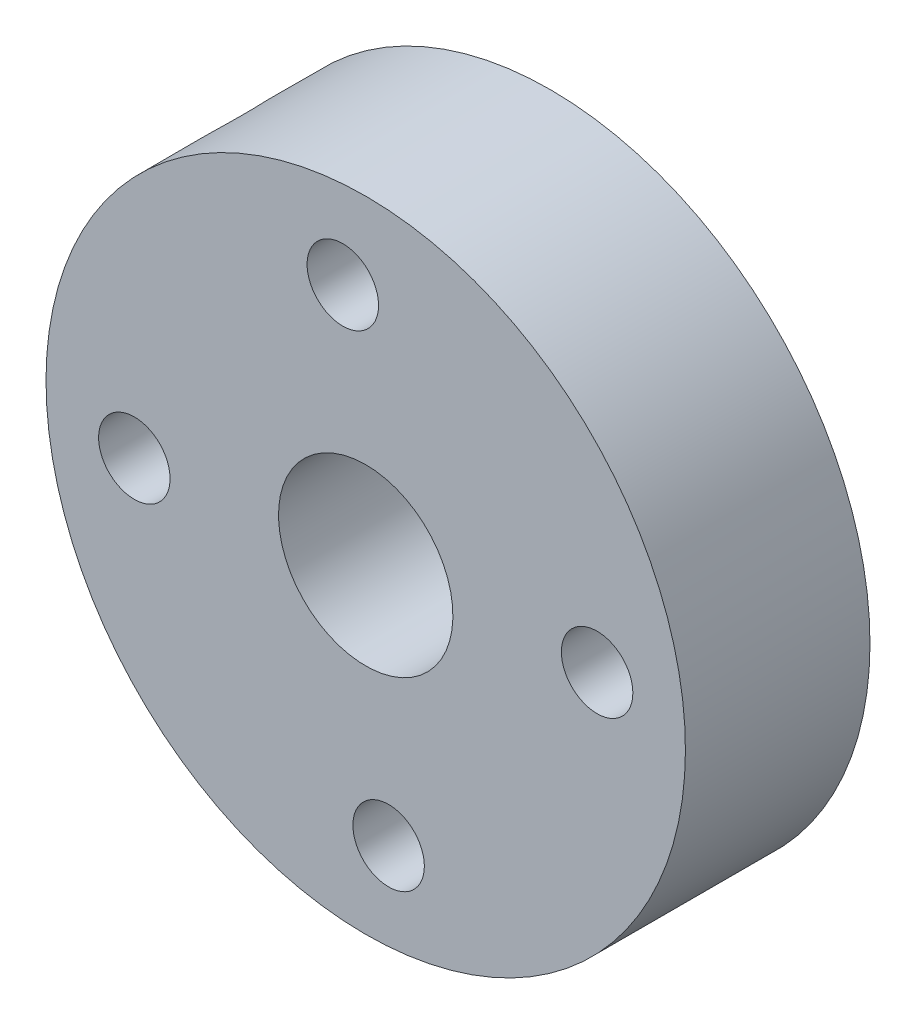
ISO-10303-21;
HEADER;
FILE_DESCRIPTION(('STEP AP214'),'2;1');
FILE_NAME('part.step','',(''),(''),'','','');
FILE_SCHEMA(('AUTOMOTIVE_DESIGN { 1 0 10303 214 1 1 1 1 }'));
ENDSEC;
DATA;
#1=APPLICATION_CONTEXT('core data for automotive mechanical design processes');
#2=APPLICATION_PROTOCOL_DEFINITION('international standard','automotive_design',2000,#1);
#3=PRODUCT_CONTEXT('',#1,'mechanical');
#4=PRODUCT('Part','Part','',(#3));
#5=PRODUCT_RELATED_PRODUCT_CATEGORY('part','',(#4));
#6=PRODUCT_DEFINITION_FORMATION('','',#4);
#7=PRODUCT_DEFINITION_CONTEXT('part definition',#1,'design');
#8=PRODUCT_DEFINITION('design','',#6,#7);
#9=PRODUCT_DEFINITION_SHAPE('','',#8);
#10=(LENGTH_UNIT() NAMED_UNIT(*) SI_UNIT(.MILLI.,.METRE.));
#11=(NAMED_UNIT(*) PLANE_ANGLE_UNIT() SI_UNIT($,.RADIAN.));
#12=(NAMED_UNIT(*) SI_UNIT($,.STERADIAN.) SOLID_ANGLE_UNIT());
#13=UNCERTAINTY_MEASURE_WITH_UNIT(LENGTH_MEASURE(1.E-05),#10,'distance_accuracy_value','');
#14=(GEOMETRIC_REPRESENTATION_CONTEXT(3) GLOBAL_UNCERTAINTY_ASSIGNED_CONTEXT((#13)) GLOBAL_UNIT_ASSIGNED_CONTEXT((#10,
#11,#12)) REPRESENTATION_CONTEXT('',''));
#15=CARTESIAN_POINT('',(0.,0.,0.));
#16=DIRECTION('',(0.,0.,1.));
#17=DIRECTION('',(1.,0.,0.));
#18=AXIS2_PLACEMENT_3D('',#15,#16,#17);
#19=CARTESIAN_POINT('',(-0.038900310608712,14.7879668365953,-36.6840283084253));
#20=DIRECTION('',(-0.77331553369717,0.634021360320503,0.));
#21=DIRECTION('',(0.634021360320503,0.77331553369717,0.));
#22=AXIS2_PLACEMENT_3D('',#19,#20,#21);
#23=CYLINDRICAL_SURFACE('',#22,1.621);
#24=CARTESIAN_POINT('',(-7.42475235088901,22.9396040606624,-36.6840283543877));
#25=CARTESIAN_POINT('',(-7.42475254380601,22.9396038732152,-36.6304046103159));
#26=CARTESIAN_POINT('',(-7.42872992096382,22.9360029474239,-36.5240742340835));
#27=CARTESIAN_POINT('',(-7.44618242724757,22.9201549097899,-36.3672329657981));
#28=CARTESIAN_POINT('',(-7.46537006407996,22.9026320034118,-36.2644276057977));
#29=CARTESIAN_POINT('',(-7.47974849760246,22.8894354376367,-36.200734252876));
#30=CARTESIAN_POINT('',(-7.48274372796669,22.8866835928413,-36.1880236458062));
#31=CARTESIAN_POINT('',(-7.48897489427435,22.8809518617799,-36.1626591063486));
#32=CARTESIAN_POINT('',(-7.49221566485465,22.8779675138978,-36.1499875018241));
#33=CARTESIAN_POINT('',(-7.5022571123378,22.8687086444031,-36.1122247558521));
#34=CARTESIAN_POINT('',(-7.50937718675431,22.8621281403565,-36.0873762795711));
#35=CARTESIAN_POINT('',(-7.53197743019163,22.8411786422239,-36.0137898764001));
#36=CARTESIAN_POINT('',(-7.56541135194677,22.8100308278377,-35.9182271352013));
#37=CARTESIAN_POINT('',(-7.60518857686291,22.772461798791,-35.8276622074126));
#38=CARTESIAN_POINT('',(-7.63736684713559,22.7418040096601,-35.7616270174845));
#39=CARTESIAN_POINT('',(-7.6540432014227,22.7258537819106,-35.7290823143442));
#40=CARTESIAN_POINT('',(-7.6716033875319,22.7089460791031,-35.6972578456551));
#41=CARTESIAN_POINT('',(-7.68053142884368,22.7003300081137,-35.6814669134544));
#42=CARTESIAN_POINT('',(-7.68353405863539,22.6974290504184,-35.6762201612893));
#43=CARTESIAN_POINT('',(-7.68957401972476,22.6915868636769,-35.6657924575548));
#44=CARTESIAN_POINT('',(-7.71691992303397,22.6651064174217,-35.6191494511803));
#45=CARTESIAN_POINT('',(-7.77134198833953,22.6118773888552,-35.5357675008243));
#46=CARTESIAN_POINT('',(-7.85467366378932,22.5286845034921,-35.4295392399293));
#47=CARTESIAN_POINT('',(-7.91439541858716,22.4677162581741,-35.3663600014793));
#48=CARTESIAN_POINT('',(-7.95301159280924,22.4277944531927,-35.3293265703395));
#49=CARTESIAN_POINT('',(-7.96079948965189,22.4197190456437,-35.3220428576166));
#50=CARTESIAN_POINT('',(-7.97650495010548,22.4033828442918,-35.307724253126));
#51=CARTESIAN_POINT('',(-7.98439226429707,22.3951535009355,-35.3007170040517));
#52=CARTESIAN_POINT('',(-8.00814234074056,22.3702954231274,-35.2801577008448));
#53=CARTESIAN_POINT('',(-8.02409876130152,22.3534908965455,-35.2670626798334));
#54=CARTESIAN_POINT('',(-8.07231758844546,22.3023799327152,-35.2295793444952));
#55=CARTESIAN_POINT('',(-8.13753867694156,22.2323744124631,-35.184397777511));
#56=CARTESIAN_POINT('',(-8.2044706629473,22.1585871027116,-35.1486865900113));
#57=CARTESIAN_POINT('',(-8.25528276386527,22.1017691960651,-35.1255131785338));
#58=CARTESIAN_POINT('',(-8.27658252420675,22.0777868554922,-35.1166109254946));
#59=CARTESIAN_POINT('',(-8.29804134652861,22.0534077559533,-35.1086690479204));
#60=CARTESIAN_POINT('',(-8.30663796051166,22.0436237187878,-35.1055694162919));
#61=CARTESIAN_POINT('',(-8.31955959705853,22.0288908541544,-35.1010332193906));
#62=CARTESIAN_POINT('',(-8.36684395109197,21.9746871316794,-35.0857889901575));
#63=CARTESIAN_POINT('',(-8.4436921748832,21.8849933987918,-35.0682920185429));
#64=CARTESIAN_POINT('',(-8.54498993290987,21.7632693791062,-35.0604421108471));
#65=CARTESIAN_POINT('',(-8.61172536738556,21.6806808371055,-35.0655552405382));
#66=CARTESIAN_POINT('',(-8.6531833643885,21.6286031157397,-35.0720886064929));
#67=CARTESIAN_POINT('',(-8.66147192881272,21.6181524144038,-35.0735647895723));
#68=CARTESIAN_POINT('',(-8.67793764436648,21.5973141131245,-35.0768374356277));
#69=CARTESIAN_POINT('',(-8.70249323769689,21.5661212434039,-35.0822299038228));
#70=CARTESIAN_POINT('',(-8.7266266212289,21.5351209143197,-35.0890552488228));
#71=CARTESIAN_POINT('',(-8.77434518705812,21.4733770108247,-35.1045853336452));
#72=CARTESIAN_POINT('',(-8.836509801973,21.3917346431697,-35.1302950101216));
#73=CARTESIAN_POINT('',(-8.89586757484594,21.3115050040987,-35.1659022665411));
#74=CARTESIAN_POINT('',(-8.93935634890257,21.2519042702388,-35.1963875012794));
#75=CARTESIAN_POINT('',(-8.95368081697058,21.2321328633375,-35.2071803440439));
#76=CARTESIAN_POINT('',(-8.97491089672967,21.2026267355254,-35.2243356520291));
#77=CARTESIAN_POINT('',(-8.9819273757933,21.1928407146826,-35.230201419943));
#78=CARTESIAN_POINT('',(-8.99580690587514,21.173416490519,-35.2421950134217));
#79=CARTESIAN_POINT('',(-9.03014878040782,21.1251880775673,-35.2728599003499));
#80=CARTESIAN_POINT('',(-9.08882745543741,21.0413361644107,-35.3340878204152));
#81=CARTESIAN_POINT('',(-9.13678004719174,20.9710301047656,-35.3969073482562));
#82=CARTESIAN_POINT('',(-9.17122069147192,20.9199441874302,-35.4471946132266));
#83=CARTESIAN_POINT('',(-9.18805948895132,20.8948128442697,-35.4731327016621));
#84=CARTESIAN_POINT('',(-9.20704196717127,20.8662349301977,-35.5048056552786));
#85=CARTESIAN_POINT('',(-9.21503544211613,20.8541490913461,-35.5186855411451));
#86=CARTESIAN_POINT('',(-9.22033289603495,20.8461281730744,-35.5280071520161));
#87=CARTESIAN_POINT('',(-9.22296724932744,20.8421337499552,-35.5327047111279));
#88=CARTESIAN_POINT('',(-9.24647385329601,20.8064411146802,-35.5751816055368));
#89=CARTESIAN_POINT('',(-9.2855636420692,20.7463746974956,-35.6538127964965));
#90=CARTESIAN_POINT('',(-9.33662854198609,20.6663056682877,-35.7808237235607));
#91=CARTESIAN_POINT('',(-9.36581488978923,20.6197167352081,-35.8715296024237));
#92=CARTESIAN_POINT('',(-9.38255002529685,20.5928139631064,-35.9301581811303));
#93=CARTESIAN_POINT('',(-9.38582154578288,20.5875444271803,-35.9419809953253));
#94=CARTESIAN_POINT('',(-9.39221308211515,20.5772307798042,-35.965823077406));
#95=CARTESIAN_POINT('',(-9.39533649180408,20.5721811554808,-35.9778566158122));
#96=CARTESIAN_POINT('',(-9.40443192778342,20.5574512785559,-36.0140670040108));
#97=CARTESIAN_POINT('',(-9.410142138121,20.5481692637633,-36.038397569645));
#98=CARTESIAN_POINT('',(-9.42624522607813,20.5219163484657,-36.1119499554926));
#99=CARTESIAN_POINT('',(-9.44498176253244,20.4911539269436,-36.2115123327968));
#100=CARTESIAN_POINT('',(-9.45844975158182,20.4688293475905,-36.3140176118685));
#101=CARTESIAN_POINT('',(-9.46658148061935,20.4553167809317,-36.3920160179386));
#102=CARTESIAN_POINT('',(-9.47015407187484,20.4493693941991,-36.4312955280956));
#103=CARTESIAN_POINT('',(-9.47297774990606,20.4446607163688,-36.4710032938283));
#104=CARTESIAN_POINT('',(-9.47426358012135,20.4425155071227,-36.4909294124992));
#105=CARTESIAN_POINT('',(-9.47467144493928,20.4418348633782,-36.497588195097));
#106=CARTESIAN_POINT('',(-9.47544325684971,20.4405466123917,-36.5108990299928));
#107=CARTESIAN_POINT('',(-9.47871858072427,20.4350779525962,-36.5707776483048));
#108=CARTESIAN_POINT('',(-9.48159035443441,20.4302705422415,-36.6835434273979));
#109=CARTESIAN_POINT('',(-9.47759872478674,20.4369524456648,-36.8419181774683));
#110=CARTESIAN_POINT('',(-9.46956396562672,20.45035972301,-36.9469529445551));
#111=CARTESIAN_POINT('',(-9.4627992969865,20.4616018953945,-37.012423654368));
#112=CARTESIAN_POINT('',(-9.46135853227648,20.4639944817584,-37.025512679334));
#113=CARTESIAN_POINT('',(-9.45830140885481,20.4690663694005,-37.0516576872572));
#114=CARTESIAN_POINT('',(-9.45346904681159,20.4770764415486,-37.09068149132));
#115=CARTESIAN_POINT('',(-9.44790355377311,20.4862752211627,-37.12913195472));
#116=CARTESIAN_POINT('',(-9.43580406933593,20.5062222007249,-37.2052827852645));
#117=CARTESIAN_POINT('',(-9.41709352452064,20.536942817098,-37.3048204918953));
#118=CARTESIAN_POINT('',(-9.39318831722832,20.5757065224232,-37.400428457243));
#119=CARTESIAN_POINT('',(-9.37323007838944,20.6077990061468,-37.4706420370347));
#120=CARTESIAN_POINT('',(-9.36623841395504,20.619000618206,-37.4937973901602));
#121=CARTESIAN_POINT('',(-9.35522565005817,20.6365675182659,-37.5281501215055));
#122=CARTESIAN_POINT('',(-9.35146231111881,20.6425582612512,-37.5395512616931));
#123=CARTESIAN_POINT('',(-9.3437960232197,20.6547349447154,-37.5621134103061));
#124=CARTESIAN_POINT('',(-9.32426570352893,20.6856895831574,-37.6179631135572));
#125=CARTESIAN_POINT('',(-9.28585603073632,20.7459206618093,-37.7135809926507));
#126=CARTESIAN_POINT('',(-9.2276114701028,20.8354290251245,-37.8308673690315));
#127=CARTESIAN_POINT('',(-9.18389926687645,20.9011257682464,-37.9022423287312));
#128=CARTESIAN_POINT('',(-9.15783914694034,20.9397943165821,-37.9404114827071));
#129=CARTESIAN_POINT('',(-9.15492173216651,20.9441166737152,-37.9446267912543));
#130=CARTESIAN_POINT('',(-9.14906126711939,20.9527859517418,-37.9529797001903));
#131=CARTESIAN_POINT('',(-9.14022711674348,20.9658341542785,-37.9654000941233));
#132=CARTESIAN_POINT('',(-9.1193095214865,20.9965872569015,-37.9936217331929));
#133=CARTESIAN_POINT('',(-9.10085753830796,21.0234634001033,-38.0165247782096));
#134=CARTESIAN_POINT('',(-9.06325110646434,21.0778826672412,-38.0606403612805));
#135=CARTESIAN_POINT('',(-9.01123769721844,21.1522166046827,-38.1149602850498));
#136=CARTESIAN_POINT('',(-8.95535246134961,21.2299616946825,-38.160347667297));
#137=CARTESIAN_POINT('',(-8.91190138641087,21.2895401912405,-38.1909647887325));
#138=CARTESIAN_POINT('',(-8.89716111257342,21.3096117414986,-38.2005988885537));
#139=CARTESIAN_POINT('',(-8.86714799600887,21.3501828880906,-38.2186982149162));
#140=CARTESIAN_POINT('',(-8.85199500440621,21.3705203334352,-38.2270907358296));
#141=CARTESIAN_POINT('',(-8.80613228182177,21.4316284357548,-38.2503162521023));
#142=CARTESIAN_POINT('',(-8.74387375930713,21.5134033826049,-38.2761078610139));
#143=CARTESIAN_POINT('',(-8.67936157277728,21.5956985132081,-38.2917523326822));
#144=CARTESIAN_POINT('',(-8.63010572523388,21.6576018250545,-38.2996466594543));
#145=CARTESIAN_POINT('',(-8.6052596949341,21.6885991797798,-38.3026325151205));
#146=CARTESIAN_POINT('',(-8.57588281277155,21.7248423779239,-38.3044069710894));
#147=CARTESIAN_POINT('',(-8.56320816901587,21.7403923379128,-38.3047972661601));
#148=CARTESIAN_POINT('',(-8.55473949731147,21.7507628096573,-38.3049747011803));
#149=CARTESIAN_POINT('',(-8.55049296215373,21.7559533019936,-38.3050220072015));
#150=CARTESIAN_POINT('',(-8.5122853069145,21.8025670096054,-38.3050729228623));
#151=CARTESIAN_POINT('',(-8.44431216542974,21.8842606050898,-38.2998667398742));
#152=CARTESIAN_POINT('',(-8.34223713534043,22.0034137822152,-38.276693941768));
#153=CARTESIAN_POINT('',(-8.27415801067575,22.0806438203195,-38.2510575634399));
#154=CARTESIAN_POINT('',(-8.23162424015952,22.1282282454371,-38.2317742364183));
#155=CARTESIAN_POINT('',(-8.2231183114817,22.1377108671775,-38.2277541613609));
#156=CARTESIAN_POINT('',(-8.20610889783111,22.1566075181385,-38.2193836993357));
#157=CARTESIAN_POINT('',(-8.19760141966637,22.1660258528651,-38.2150306756232));
#158=CARTESIAN_POINT('',(-8.17222569363446,22.1940219776145,-38.2015482839988));
#159=CARTESIAN_POINT('',(-8.15545762239319,22.2123927873879,-38.1919739105718));
#160=CARTESIAN_POINT('',(-8.10560206340204,22.266652050679,-38.1615266627752));
#161=CARTESIAN_POINT('',(-8.0403222486148,22.3367269515771,-38.1163412404551));
#162=CARTESIAN_POINT('',(-7.97751336506645,22.4024516414816,-38.0621312370611));
#163=CARTESIAN_POINT('',(-7.93139847175052,22.4501441899614,-38.0180475398295));
#164=CARTESIAN_POINT('',(-7.90858947431638,22.4735896242011,-37.9951477631054));
#165=CARTESIAN_POINT('',(-7.8861707642422,22.4964335177239,-37.9709379881341));
#166=CARTESIAN_POINT('',(-7.8713138573457,22.5115289065922,-37.9545039118597));
#167=CARTESIAN_POINT('',(-7.83455041114246,22.5487727036631,-37.9128514309103));
#168=CARTESIAN_POINT('',(-7.77175383997321,22.6114693961099,-37.8328630343459));
#169=CARTESIAN_POINT('',(-7.69527878840426,22.6862758741052,-37.7157894756586));
#170=CARTESIAN_POINT('',(-7.64929934659884,22.7304300332009,-37.6307738139789));
#171=CARTESIAN_POINT('',(-7.62493347424619,22.753650412183,-37.5809285072911));
#172=CARTESIAN_POINT('',(-7.62224700737486,22.7562079478512,-37.5753619572372));
#173=CARTESIAN_POINT('',(-7.61691618486208,22.7612778765602,-37.5641721414764));
#174=CARTESIAN_POINT('',(-7.61427071694881,22.7637913223264,-37.5585463885182));
#175=CARTESIAN_POINT('',(-7.60641917986979,22.7712437631708,-37.5416295243355));
#176=CARTESIAN_POINT('',(-7.59103650178631,22.7858151018434,-37.5075971066158));
#177=CARTESIAN_POINT('',(-7.57660902117906,22.7994028175572,-37.4729754945383));
#178=CARTESIAN_POINT('',(-7.54902102382174,22.8252997677649,-37.4029584493372));
#179=CARTESIAN_POINT('',(-7.51561112175109,22.8564264924428,-37.3075422524107));
#180=CARTESIAN_POINT('',(-7.48901208265828,22.880931671347,-37.2080398823693));
#181=CARTESIAN_POINT('',(-7.47170741748628,22.8968163123281,-37.1318490127574));
#182=CARTESIAN_POINT('',(-7.4663806657117,22.90169465896,-37.1061909111439));
#183=CARTESIAN_POINT('',(-7.45907087488634,22.9083781375851,-37.0673036227647));
#184=CARTESIAN_POINT('',(-7.45674566579999,22.9105021035858,-37.0542611143609));
#185=CARTESIAN_POINT('',(-7.4523442371734,22.9145195657389,-37.0281564890269));
#186=CARTESIAN_POINT('',(-7.44195466008474,22.9239940301968,-36.9627958261359));
#187=CARTESIAN_POINT('',(-7.4287308983751,22.9360018577009,-36.844261959602));
#188=CARTESIAN_POINT('',(-7.42475215797204,22.9396042481096,-36.7376520984595));
#189=CARTESIAN_POINT('',(-7.42475235088901,22.9396040606624,-36.6840283543877));
#190=(BOUNDED_CURVE() B_SPLINE_CURVE(3,(#24,#25,#26,#27,#28,#29,#30,#31,#32,#33,#34,#35,#36,#37,
#38,#39,#40,#41,#42,#43,#44,#45,#46,#47,#48,#49,#50,#51,#52,#53,#54,#55,#56,#57,#58,#59,#60,#61,
#62,#63,#64,#65,#66,#67,#68,#69,#70,#71,#72,#73,#74,#75,#76,#77,#78,#79,#80,#81,#82,#83,#84,#85,
#86,#87,#88,#89,#90,#91,#92,#93,#94,#95,#96,#97,#98,#99,#100,#101,#102,#103,#104,#105,#106,#107,
#108,#109,#110,#111,#112,#113,#114,#115,#116,#117,#118,#119,#120,#121,#122,#123,#124,#125,#126,
#127,#128,#129,#130,#131,#132,#133,#134,#135,#136,#137,#138,#139,#140,#141,#142,#143,#144,#145,
#146,#147,#148,#149,#150,#151,#152,#153,#154,#155,#156,#157,#158,#159,#160,#161,#162,#163,#164,
#165,#166,#167,#168,#169,#170,#171,#172,#173,#174,#175,#176,#177,#178,#179,#180,#181,#182,#183,
#184,#185,#186,#187,#188,#189),.UNSPECIFIED.,.T.,.F.) B_SPLINE_CURVE_WITH_KNOTS((4,1,1,2,2,2,2,
1,2,1,2,2,1,1,1,2,2,2,2,1,2,1,2,1,1,1,1,2,2,1,2,1,2,2,2,1,1,2,1,1,2,2,1,1,2,2,2,2,1,2,1,2,2,1,1,
1,2,2,1,2,1,2,2,2,1,1,1,2,2,1,1,2,1,2,2,2,1,2,1,1,2,2,1,1,2,2,2,2,1,2,1,2,1,1,1,2,2,2,1,2,1,2,2,
2,1,1,4),(0.,0.0156249999999993,0.0312499999999987,0.046874999999998,0.0507812499999978,
0.0546874999999975,0.062499999999997,0.0781249999999962,0.0937499999999953,0.101562499999995,
0.105468749999995,0.107421874999995,0.109374999999995,0.124999999999995,0.140624999999995,
0.156249999999996,0.160156249999996,0.164062499999996,0.171874999999996,0.187499999999996,
0.203124999999995,0.210937499999995,0.212890624999995,0.214843749999995,0.218749999999995,
0.234374999999995,0.249999999999994,0.265624999999994,0.269531249999994,0.273437499999994,
0.281249999999993,0.296874999999993,0.312499999999993,0.320312499999993,0.324218749999992,
0.328124999999992,0.343749999999992,0.359374999999991,0.367187499999991,0.371093749999991,
0.37304687499999,0.37499999999999,0.39062499999999,0.40624999999999,0.42187499999999,
0.42578124999999,0.42968749999999,0.43749999999999,0.45312499999999,0.46874999999999,
0.47656249999999,0.48046874999999,0.48242187499999,0.48437499999999,0.49999999999999,
0.51562499999999,0.53124999999999,0.53515624999999,0.53906249999999,0.54687499999999,
0.56249999999999,0.57812499999999,0.58593749999999,0.58984374999999,0.59374999999999,
0.60937499999999,0.624999999999991,0.640624999999992,0.642578124999992,0.644531249999992,
0.648437499999992,0.656249999999992,0.671874999999992,0.687499999999992,0.695312499999992,
0.703125,0.71875,0.734375,0.7421875,0.746093749999993,0.748046874999993,0.75,0.765625,0.78125,
0.796875,0.800781249999994,0.8046875,0.8125,0.828125,0.84375,0.8515625,0.855468749999994,
0.859375,0.875,0.890625,0.90625,0.908203124999995,0.910156249999995,0.9140625,0.921875,0.9375,
0.953125,0.9609375,0.964843749999998,0.96875,0.984375,1.),
.UNSPECIFIED.) CURVE() GEOMETRIC_REPRESENTATION_ITEM() RATIONAL_B_SPLINE_CURVE((1.,1.,1.,1.,1.,
1.,1.,1.,1.,1.,1.,1.,1.,1.,1.,1.,1.,1.,1.,1.,1.,1.,1.,1.,1.,1.,1.,1.,1.,1.,1.,1.,1.,1.,1.,1.,1.,
1.,1.,1.,1.,1.,1.,1.,1.,1.,1.,1.,1.,1.,1.,1.,1.,1.,1.,1.,1.,1.,1.,1.,1.,1.,1.,1.,1.,1.,1.,1.,1.,
1.,1.,1.,1.,1.,1.,1.,1.,1.,1.,1.,1.,1.,1.,1.,1.,1.,1.,1.,1.,1.,1.,1.,1.,1.,1.,1.,1.,1.,1.,1.,1.,
1.,1.,1.,1.,1.,1.,1.,1.,1.,1.,1.,1.,1.,1.,1.,1.,1.,1.,1.,1.,1.,1.,1.,1.,1.,1.,1.,1.,1.,1.,1.,1.,
1.,1.,1.,1.,1.,1.,1.,1.,1.,1.,1.,1.,1.,1.,1.,1.,1.,1.,1.,1.,1.,1.,1.,1.,1.,1.,1.,1.,1.,1.,1.,1.,1.)) REPRESENTATION_ITEM(''));
#191=CARTESIAN_POINT('',(-7.42475235088906,22.9396040606624,-36.6840283543877));
#192=VERTEX_POINT('',#191);
#193=EDGE_CURVE('E67',#192,#192,#190,.T.);
#194=ORIENTED_EDGE('',*,*,#193,.F.);
#195=EDGE_LOOP('',(#194));
#196=FACE_BOUND('',#195,.T.);
#197=CARTESIAN_POINT('',(-2.38149997641126,18.8047723600905,-36.684028287476));
#198=CARTESIAN_POINT('',(-2.38150034926328,18.8047720469452,-36.738035284932));
#199=CARTESIAN_POINT('',(-2.38646522740284,18.8018829564625,-36.8450479687274));
#200=CARTESIAN_POINT('',(-2.40815081018859,18.7891548548549,-37.0026852106719));
#201=CARTESIAN_POINT('',(-2.43185866123999,18.7750113527455,-37.1058861458548));
#202=CARTESIAN_POINT('',(-2.44955019407217,18.7643073956972,-37.169789856298));
#203=CARTESIAN_POINT('',(-2.45507328567877,18.7609561046138,-37.1889157002174));
#204=CARTESIAN_POINT('',(-2.46092154758202,18.7573897807087,-37.2079748168074));
#205=CARTESIAN_POINT('',(-2.46488091582453,18.754971188483,-37.2206294024221));
#206=CARTESIAN_POINT('',(-2.47493765267967,18.7488177892865,-37.2521599694349));
#207=CARTESIAN_POINT('',(-2.4857757700842,18.7421312993378,-37.2831662509958));
#208=CARTESIAN_POINT('',(-2.51322577173603,18.7250572575843,-37.3566025411698));
#209=CARTESIAN_POINT('',(-2.55365354987223,18.6995599236731,-37.4519129482249));
#210=CARTESIAN_POINT('',(-2.60124484610183,18.6684092521352,-37.5421859278396));
#211=CARTESIAN_POINT('',(-2.63951199646592,18.6427761151597,-37.6080087943529));
#212=CARTESIAN_POINT('',(-2.65269738684671,18.6338525541264,-37.6296355176419));
#213=CARTESIAN_POINT('',(-2.67311249005958,18.6198716136804,-37.6615996556296));
#214=CARTESIAN_POINT('',(-2.68002255776627,18.6151126849132,-37.6721723311968));
#215=CARTESIAN_POINT('',(-2.69397884712967,18.6054437982817,-37.6930488691876));
#216=CARTESIAN_POINT('',(-2.72925714531621,18.5808620409089,-37.7446354682831));
#217=CARTESIAN_POINT('',(-2.79611308654817,18.532918057609,-37.8321571969124));
#218=CARTESIAN_POINT('',(-2.85984760121689,18.484788336431,-37.9026047342147));
#219=CARTESIAN_POINT('',(-2.90914586003381,18.4464670334676,-37.9526841272576));
#220=CARTESIAN_POINT('',(-2.9258287366707,18.4333219536049,-37.9689169725904));
#221=CARTESIAN_POINT('',(-2.95968166433501,18.4062545462776,-38.0004508018284));
#222=CARTESIAN_POINT('',(-2.97685692258338,18.3923279599779,-38.0157562410741));
#223=CARTESIAN_POINT('',(-3.02906900539876,18.3493467952441,-38.0602183714808));
#224=CARTESIAN_POINT('',(-3.09942663350625,18.2897283039736,-38.1147168517201));
#225=CARTESIAN_POINT('',(-3.20667411289391,18.1931020614476,-38.1825576024199));
#226=CARTESIAN_POINT('',(-3.27905532940494,18.123610976856,-38.2185221764359));
#227=CARTESIAN_POINT('',(-3.33360213076881,18.0694446302586,-38.241916019774));
#228=CARTESIAN_POINT('',(-3.3518281375812,18.0510473701998,-38.2491162136267));
#229=CARTESIAN_POINT('',(-3.38835896378755,18.0135384272072,-38.2622882734614));
#230=CARTESIAN_POINT('',(-3.4065041346436,17.994590394916,-38.2682022203737));
#231=CARTESIAN_POINT('',(-3.46052891128586,17.9372077547775,-38.2839527514306));
#232=CARTESIAN_POINT('',(-3.53150419013132,17.859223337386,-38.2996666530945));
#233=CARTESIAN_POINT('',(-3.60029656876036,17.7782516060278,-38.3049923514999));
#234=CARTESIAN_POINT('',(-3.65104929951137,17.7163778834668,-38.3050457456762));
#235=CARTESIAN_POINT('',(-3.67621530279281,17.6851546440816,-38.304085612468));
#236=CARTESIAN_POINT('',(-3.70106164361213,17.6534955440332,-38.3016194074807));
#237=CARTESIAN_POINT('',(-3.71755438375062,17.6322918201814,-38.2996367154326));
#238=CARTESIAN_POINT('',(-3.72577595604213,17.6216266280051,-38.298473987477));
#239=CARTESIAN_POINT('',(-3.76648300496814,17.5683453486316,-38.2918419035206));
#240=CARTESIAN_POINT('',(-3.82928456826161,17.4830896635213,-38.2759939815599));
#241=CARTESIAN_POINT('',(-3.9169242116687,17.3553082041763,-38.2370839575485));
#242=CARTESIAN_POINT('',(-3.97119260304092,17.2703161782471,-38.2011230885078));
#243=CARTESIAN_POINT('',(-4.00386226816472,17.217314842353,-38.1754429777862));
#244=CARTESIAN_POINT('',(-4.01033975097881,17.206710443918,-38.1701407419521));
#245=CARTESIAN_POINT('',(-4.02310419995128,17.1856263970187,-38.1592703643085));
#246=CARTESIAN_POINT('',(-4.04198711512593,17.1541521302081,-38.1425492625043));
#247=CARTESIAN_POINT('',(-4.06010075234774,17.1231336973528,-38.1245978517627));
#248=CARTESIAN_POINT('',(-4.09535331783895,17.0617122139454,-38.0870831076812));
#249=CARTESIAN_POINT('',(-4.13976147993663,16.9814541953581,-38.0327732627905));
#250=CARTESIAN_POINT('',(-4.17942219574725,16.9046464871536,-37.9699767084523));
#251=CARTESIAN_POINT('',(-4.20283208400539,16.8578175137029,-37.9280208146182));
#252=CARTESIAN_POINT('',(-4.20744504169415,16.8485106908814,-37.9194938915498));
#253=CARTESIAN_POINT('',(-4.2165351012718,16.8300181842205,-37.9021657506367));
#254=CARTESIAN_POINT('',(-4.22101759423339,16.8208212451212,-37.8933532378613));
#255=CARTESIAN_POINT('',(-4.23420534270466,16.7935400136925,-37.8666208629413));
#256=CARTESIAN_POINT('',(-4.24266191619508,16.7757438723102,-37.8483886229869));
#257=CARTESIAN_POINT('',(-4.26708700016185,16.7235323972403,-37.7924782411716));
#258=CARTESIAN_POINT('',(-4.29714004771425,16.65704970774,-37.7147009224328));
#259=CARTESIAN_POINT('',(-4.32268248071663,16.5970134099203,-37.6304988197122));
#260=CARTESIAN_POINT('',(-4.34028657454635,16.5545485654595,-37.5648740875322));
#261=CARTESIAN_POINT('',(-4.34869969611264,16.5339578429287,-37.5314423416417));
#262=CARTESIAN_POINT('',(-4.35654806116539,16.5143693347319,-37.4970575660742));
#263=CARTESIAN_POINT('',(-4.36165647493967,16.5015382028354,-37.4739192291613));
#264=CARTESIAN_POINT('',(-4.36414943309348,16.4952347503766,-37.4622379203581));
#265=CARTESIAN_POINT('',(-4.37624138604897,16.4644726108219,-37.4036213048527));
#266=CARTESIAN_POINT('',(-4.39332803127296,16.4197836761858,-37.307978867132));
#267=CARTESIAN_POINT('',(-4.41288636110136,16.3664292866907,-37.159008701022));
#268=CARTESIAN_POINT('',(-4.42216217253354,16.3402688481054,-37.0559607466157));
#269=CARTESIAN_POINT('',(-4.42681579608621,16.3270268005435,-36.990334891097));
#270=CARTESIAN_POINT('',(-4.42768910362806,16.3245341289967,-36.977148533467));
#271=CARTESIAN_POINT('',(-4.4293207437381,16.3198658326685,-36.9506515025517));
#272=CARTESIAN_POINT('',(-4.43007935816459,16.3176893838577,-36.9373316993403));
#273=CARTESIAN_POINT('',(-4.43217002161267,16.3116791596935,-36.8974321123789));
#274=CARTESIAN_POINT('',(-4.43332234606658,16.3083493236684,-36.8708336504285));
#275=CARTESIAN_POINT('',(-4.43608019824726,16.3003625409704,-36.7910419912439));
#276=CARTESIAN_POINT('',(-4.43789945179379,16.2950470112806,-36.6846630346254));
#277=CARTESIAN_POINT('',(-4.43610926646184,16.3002778448482,-36.5783036609047));
#278=CARTESIAN_POINT('',(-4.43337538099909,16.3081959813288,-36.4985415625818));
#279=CARTESIAN_POINT('',(-4.43194548609526,16.3123285235669,-36.4653089055135));
#280=CARTESIAN_POINT('',(-4.43013905802617,16.31751695725,-36.4320782178393));
#281=CARTESIAN_POINT('',(-4.42938601444116,16.3196771854727,-36.4187861011596));
#282=CARTESIAN_POINT('',(-4.42899400668122,16.3208004401428,-36.4121363239624));
#283=CARTESIAN_POINT('',(-4.42777550636518,16.3242876426031,-36.3922431333912));
#284=CARTESIAN_POINT('',(-4.42342339522289,16.3367104227117,-36.3262344899838));
#285=CARTESIAN_POINT('',(-4.41300450244783,16.3661015307737,-36.2100803611785));
#286=CARTESIAN_POINT('',(-4.39995123040505,16.4017191541488,-36.1104629336949));
#287=CARTESIAN_POINT('',(-4.38862670265633,16.4318937605159,-36.0370925228584));
#288=CARTESIAN_POINT('',(-4.38257982330276,16.447847666117,-36.0007435204914));
#289=CARTESIAN_POINT('',(-4.375924411399,16.4650959060034,-35.9649008623779));
#290=CARTESIAN_POINT('',(-4.37134811824104,16.4768824533243,-35.9411188162733));
#291=CARTESIAN_POINT('',(-4.36898729591532,16.4829271583299,-35.9292704244986));
#292=CARTESIAN_POINT('',(-4.35688265131073,16.5137215082115,-35.870593093163));
#293=CARTESIAN_POINT('',(-4.33554695661299,16.5667674289239,-35.7800193149063));
#294=CARTESIAN_POINT('',(-4.29723650547725,16.6568317998024,-35.6536191956829));
#295=CARTESIAN_POINT('',(-4.26708303911847,16.7235451721654,-35.575552050592));
#296=CARTESIAN_POINT('',(-4.24661705091325,16.7672882167117,-35.5287258944037));
#297=CARTESIAN_POINT('',(-4.24243778063224,16.7761496054649,-35.519448863764));
#298=CARTESIAN_POINT('',(-4.23393504344943,16.7940280537455,-35.501144087536));
#299=CARTESIAN_POINT('',(-4.22098080697783,16.8210457170236,-35.4740942264526));
#300=CARTESIAN_POINT('',(-4.20741744319447,16.8486462224698,-35.4482497884594));
#301=CARTESIAN_POINT('',(-4.17945057484426,16.9045872497669,-35.3981388661464));
#302=CARTESIAN_POINT('',(-4.1399238798797,16.9811440632917,-35.3355240662273));
#303=CARTESIAN_POINT('',(-4.09555155018347,17.0613594188077,-35.2812025957971));
#304=CARTESIAN_POINT('',(-4.06027158387564,17.1228397154999,-35.2436315958367));
#305=CARTESIAN_POINT('',(-4.04515421266473,17.148731856772,-35.228638656895));
#306=CARTESIAN_POINT('',(-4.02948559515235,17.1749663593669,-35.2144913396462));
#307=CARTESIAN_POINT('',(-4.02317339168526,17.185487566503,-35.2089005522751));
#308=CARTESIAN_POINT('',(-4.0199929587895,17.1907650754189,-35.2061376182524));
#309=CARTESIAN_POINT('',(-4.01040972009159,17.2065956449324,-35.1979733313196));
#310=CARTESIAN_POINT('',(-3.97815429794277,17.25940422497,-35.1715661682837));
#311=CARTESIAN_POINT('',(-3.9172751109095,17.354770536892,-35.1311791012627));
#312=CARTESIAN_POINT('',(-3.82983139775809,17.4823150010153,-35.092261073995));
#313=CARTESIAN_POINT('',(-3.76712908082133,17.5674780589263,-35.0763598366371));
#314=CARTESIAN_POINT('',(-3.73053630480605,17.6153982800731,-35.0703536802798));
#315=CARTESIAN_POINT('',(-3.72645204305072,17.6207229871585,-35.0697272477226));
#316=CARTESIAN_POINT('',(-3.7182463862301,17.6313728300826,-35.0685568051254));
#317=CARTESIAN_POINT('',(-3.71412549176213,17.6366972683141,-35.0680129542));
#318=CARTESIAN_POINT('',(-3.70174550007755,17.6526214366972,-35.0665100368356));
#319=CARTESIAN_POINT('',(-3.67687809522042,17.6843228205693,-35.0640137233789));
#320=CARTESIAN_POINT('',(-3.65169045089759,17.7155871302892,-35.0630267691833));
#321=CARTESIAN_POINT('',(-3.6008936997027,17.7775413587169,-35.0630313950155));
#322=CARTESIAN_POINT('',(-3.53204072033392,17.8586162123672,-35.0683042618285));
#323=CARTESIAN_POINT('',(-3.46100102098115,17.9366956663883,-35.0839866553882));
#324=CARTESIAN_POINT('',(-3.41593909950294,17.9845715862512,-35.0970987480819));
#325=CARTESIAN_POINT('',(-3.4023708810845,17.9988650358384,-35.1012812386876));
#326=CARTESIAN_POINT('',(-3.38872885603271,18.0130547008033,-35.1058404682311));
#327=CARTESIAN_POINT('',(-3.37961784654673,18.0224914323706,-35.1089641205526));
#328=CARTESIAN_POINT('',(-3.3750508613088,18.0272016712439,-35.1105692469222));
#329=CARTESIAN_POINT('',(-3.35222827196935,18.050641015158,-35.118787209623));
#330=CARTESIAN_POINT('',(-3.33400065743257,18.0690445847313,-35.1259785621211));
#331=CARTESIAN_POINT('',(-3.27942324342365,18.1232540898476,-35.1493591645975));
#332=CARTESIAN_POINT('',(-3.20693270249529,18.1928674239997,-35.185341341995));
#333=CARTESIAN_POINT('',(-3.13519664358412,18.2575038050133,-35.2307053777451));
#334=CARTESIAN_POINT('',(-3.08177756747591,18.3042087848754,-35.2682685246775));
#335=CARTESIAN_POINT('',(-3.05959973934444,18.3232995171807,-35.2846586674335));
#336=CARTESIAN_POINT('',(-3.03753831210955,18.3419369154405,-35.3019864743835));
#337=CARTESIAN_POINT('',(-3.02872341586485,18.3493557488946,-35.3089930139383));
#338=CARTESIAN_POINT('',(-3.02431909023886,18.3530485185675,-35.3125354379515));
#339=CARTESIAN_POINT('',(-3.01115504078096,18.3640447586295,-35.3232481484362));
#340=CARTESIAN_POINT('',(-2.96755181256831,18.4001919717167,-35.3595717286681));
#341=CARTESIAN_POINT('',(-2.89156363980982,18.4608395655795,-35.43038731027));
#342=CARTESIAN_POINT('',(-2.79590323160095,18.5330757390701,-35.5361385127923));
#343=CARTESIAN_POINT('',(-2.73625466920321,18.5758428474147,-35.6142636819941));
#344=CARTESIAN_POINT('',(-2.70042398625886,18.6009536316848,-35.6655761875195));
#345=CARTESIAN_POINT('',(-2.69334481067816,18.6058846307217,-35.6759432903235));
#346=CARTESIAN_POINT('',(-2.6794043247692,18.6155392559925,-35.696823678551));
#347=CARTESIAN_POINT('',(-2.65880087161311,18.6297236846452,-35.7283920015384));
#348=CARTESIAN_POINT('',(-2.63912333363926,18.6430380251575,-35.7606983118004));
#349=CARTESIAN_POINT('',(-2.60102243402158,18.6685546805462,-35.8262890551647));
#350=CARTESIAN_POINT('',(-2.5535626549062,18.6996181038554,-35.9163480639464));
#351=CARTESIAN_POINT('',(-2.51313326247487,18.7251151349878,-36.0116744217039));
#352=CARTESIAN_POINT('',(-2.48565436263366,18.7422064556382,-36.0852283692105));
#353=CARTESIAN_POINT('',(-2.47696939992814,18.7475642067835,-36.1100902015835));
#354=CARTESIAN_POINT('',(-2.46673489879008,18.7538368516202,-36.1416114110235));
#355=CARTESIAN_POINT('',(-2.46471912250422,18.7550701206183,-36.1479380481601));
#356=CARTESIAN_POINT('',(-2.46076234005344,18.7574869212559,-36.1605975140176));
#357=CARTESIAN_POINT('',(-2.45493428047868,18.7610408416819,-36.1796102370334));
#358=CARTESIAN_POINT('',(-2.43474777491,18.7732878419936,-36.2495830699239));
#359=CARTESIAN_POINT('',(-2.40813641914578,18.7891634214,-36.365484117098));
#360=CARTESIAN_POINT('',(-2.39369197576702,18.7976411187654,-36.4704834907742));
#361=CARTESIAN_POINT('',(-2.38641180125139,18.8019047671256,-36.5499880187707));
#362=CARTESIAN_POINT('',(-2.38366099317591,18.8035116716126,-36.5899293063588));
#363=CARTESIAN_POINT('',(-2.38227355849532,18.8043211472976,-36.6301597011968));
#364=CARTESIAN_POINT('',(-2.38165548221258,18.8046817049835,-36.6570450017248));
#365=CARTESIAN_POINT('',(-2.38149988319825,18.8047724383768,-36.670526538112));
#366=CARTESIAN_POINT('',(-2.38149997641126,18.8047723600905,-36.684028287476));
#367=(BOUNDED_CURVE() B_SPLINE_CURVE(3,(#197,#198,#199,#200,#201,#202,#203,#204,#205,#206,#207,
#208,#209,#210,#211,#212,#213,#214,#215,#216,#217,#218,#219,#220,#221,#222,#223,#224,#225,#226,
#227,#228,#229,#230,#231,#232,#233,#234,#235,#236,#237,#238,#239,#240,#241,#242,#243,#244,#245,
#246,#247,#248,#249,#250,#251,#252,#253,#254,#255,#256,#257,#258,#259,#260,#261,#262,#263,#264,
#265,#266,#267,#268,#269,#270,#271,#272,#273,#274,#275,#276,#277,#278,#279,#280,#281,#282,#283,
#284,#285,#286,#287,#288,#289,#290,#291,#292,#293,#294,#295,#296,#297,#298,#299,#300,#301,#302,
#303,#304,#305,#306,#307,#308,#309,#310,#311,#312,#313,#314,#315,#316,#317,#318,#319,#320,#321,
#322,#323,#324,#325,#326,#327,#328,#329,#330,#331,#332,#333,#334,#335,#336,#337,#338,#339,#340,
#341,#342,#343,#344,#345,#346,#347,#348,#349,#350,#351,#352,#353,#354,#355,#356,#357,#358,#359,
#360,#361,#362,#363,#364,#365,#366),.UNSPECIFIED.,.T.,.F.) B_SPLINE_CURVE_WITH_KNOTS((4,1,1,2,1,
2,1,2,1,2,2,2,1,1,2,2,2,1,1,2,2,2,1,2,1,2,2,1,1,2,2,1,2,1,2,2,2,2,1,2,1,2,2,1,1,2,2,2,2,1,2,1,2,
2,1,1,2,1,2,2,1,1,2,2,1,2,1,2,1,2,2,1,1,1,2,2,2,1,2,1,2,1,2,2,2,1,2,1,2,2,1,1,1,2,2,1,2,1,2,2,2,
1,1,1,2,1,2,4),(0.,0.0156249999999996,0.0312499999999992,0.0468749999999988,0.0507812499999986,
0.0527343749999985,0.0546874999999984,0.0624999999999982,0.078124999999998,0.0937499999999978,
0.101562499999998,0.105468749999998,0.109374999999998,0.124999999999997,0.140624999999997,
0.148437499999997,0.156249999999997,0.171874999999997,0.187499999999997,0.203124999999996,
0.210937499999996,0.218749999999996,0.234374999999996,0.249999999999996,0.257812499999995,
0.261718749999995,0.265624999999995,0.281249999999995,0.296874999999995,0.312499999999994,
0.316406249999994,0.320312499999994,0.328124999999994,0.343749999999994,0.359374999999994,
0.363281249999994,0.367187499999994,0.374999999999994,0.390624999999994,0.406249999999994,
0.414062499999994,0.417968749999994,0.421874999999994,0.437499999999994,0.453124999999994,
0.468749999999994,0.472656249999994,0.476562499999994,0.484374999999994,0.499999999999994,
0.515625,0.5234375,0.525390624999995,0.527343749999995,0.53125,0.546875,0.5625,0.5703125,
0.574218749999995,0.578125,0.59375,0.609375,0.625,0.628906249999995,0.6328125,0.640625,0.65625,
0.671875,0.6796875,0.681640624999996,0.683593749999996,0.6875,0.703125,0.71875,0.734375,
0.736328124999997,0.738281249999997,0.7421875,0.75,0.765625,0.78125,0.785156249999998,
0.787109374999998,0.7890625,0.796875,0.8125,0.828125,0.8359375,0.837890624999999,
0.839843749999999,0.84375,0.859375,0.875,0.890625,0.894531249999999,0.8984375,0.90625,0.921875,
0.9375,0.9453125,0.947265625,0.94921875,0.953125,0.96875,0.984375,0.9921875,0.99609375,1.),
.UNSPECIFIED.) CURVE() GEOMETRIC_REPRESENTATION_ITEM() RATIONAL_B_SPLINE_CURVE((1.,1.,1.,1.,1.,
1.,1.,1.,1.,1.,1.,1.,1.,1.,1.,1.,1.,1.,1.,1.,1.,1.,1.,1.,1.,1.,1.,1.,1.,1.,1.,1.,1.,1.,1.,1.,1.,
1.,1.,1.,1.,1.,1.,1.,1.,1.,1.,1.,1.,1.,1.,1.,1.,1.,1.,1.,1.,1.,1.,1.,1.,1.,1.,1.,1.,1.,1.,1.,1.,
1.,1.,1.,1.,1.,1.,1.,1.,1.,1.,1.,1.,1.,1.,1.,1.,1.,1.,1.,1.,1.,1.,1.,1.,1.,1.,1.,1.,1.,1.,1.,1.,
1.,1.,1.,1.,1.,1.,1.,1.,1.,1.,1.,1.,1.,1.,1.,1.,1.,1.,1.,1.,1.,1.,1.,1.,1.,1.,1.,1.,1.,1.,1.,1.,
1.,1.,1.,1.,1.,1.,1.,1.,1.,1.,1.,1.,1.,1.,1.,1.,1.,1.,1.,1.,1.,1.,1.,1.,1.,1.,1.,1.,1.,1.,1.,1.,
1.,1.,1.,1.,1.)) REPRESENTATION_ITEM(''));
#368=CARTESIAN_POINT('',(-2.38149997641126,18.8047723600905,-36.684028287476));
#369=VERTEX_POINT('',#368);
#370=EDGE_CURVE('E77',#369,#369,#367,.T.);
#371=ORIENTED_EDGE('',*,*,#370,.F.);
#372=EDGE_LOOP('',(#371));
#373=FACE_BOUND('',#372,.T.);
#374=ADVANCED_FACE('F47',(#196,#373),#23,.F.);
#375=CARTESIAN_POINT('',(-0.0389003106087112,14.7879668365953,-33.5090283084253));
#376=DIRECTION('',(0.,0.,-1.));
#377=DIRECTION('',(-0.634021360320503,-0.77331553369717,0.));
#378=AXIS2_PLACEMENT_3D('',#375,#376,#377);
#379=CYLINDRICAL_SURFACE('',#378,3.);
#380=CARTESIAN_POINT('',(-0.0389003106087112,14.7879668365953,-33.5090283084253));
#381=DIRECTION('',(0.,0.,1.));
#382=DIRECTION('',(-0.77331553369717,0.634021360320503,0.));
#383=AXIS2_PLACEMENT_3D('',#380,#381,#382);
#384=CIRCLE('',#383,3.);
#385=CARTESIAN_POINT('',(-2.35884691170022,16.6900309175568,-33.5090283084253));
#386=VERTEX_POINT('',#385);
#387=EDGE_CURVE('E11',#386,#386,#384,.T.);
#388=ORIENTED_EDGE('',*,*,#387,.T.);
#389=EDGE_LOOP('',(#388));
#390=FACE_BOUND('',#389,.T.);
#391=CARTESIAN_POINT('',(-0.0389003106087139,14.7879668365953,-43.2090283084253));
#392=DIRECTION('',(0.,0.,-1.));
#393=DIRECTION('',(-0.634021360320503,-0.77331553369717,0.));
#394=AXIS2_PLACEMENT_3D('',#391,#392,#393);
#395=CIRCLE('',#394,3.);
#396=CARTESIAN_POINT('',(-1.94096439157022,12.4680202355038,-43.2090283084253));
#397=VERTEX_POINT('',#396);
#398=EDGE_CURVE('E57',#397,#397,#395,.T.);
#399=ORIENTED_EDGE('',*,*,#398,.T.);
#400=EDGE_LOOP('',(#399));
#401=FACE_BOUND('',#400,.T.);
#402=ADVANCED_FACE('F225',(#390,#401),#379,.F.);
#403=CARTESIAN_POINT('',(-0.0389003106087112,14.7879668365953,-33.5090283084253));
#404=DIRECTION('',(0.,0.,-1.));
#405=DIRECTION('',(-0.634021360320503,-0.77331553369717,0.));
#406=AXIS2_PLACEMENT_3D('',#403,#404,#405);
#407=CYLINDRICAL_SURFACE('',#406,11.);
#408=ORIENTED_EDGE('',*,*,#193,.T.);
#409=EDGE_LOOP('',(#408));
#410=FACE_BOUND('',#409,.T.);
#411=CARTESIAN_POINT('',(-0.0389003106087112,14.7879668365953,-33.5090283084253));
#412=DIRECTION('',(0.,0.,1.));
#413=DIRECTION('',(-0.77331553369717,0.634021360320503,0.));
#414=AXIS2_PLACEMENT_3D('',#411,#412,#413);
#415=CIRCLE('',#414,11.);
#416=CARTESIAN_POINT('',(-8.54537118127758,21.7622018001209,-33.5090283084253));
#417=VERTEX_POINT('',#416);
#418=EDGE_CURVE('E107',#417,#417,#415,.T.);
#419=ORIENTED_EDGE('',*,*,#418,.F.);
#420=EDGE_LOOP('',(#419));
#421=FACE_BOUND('',#420,.T.);
#422=CARTESIAN_POINT('',(-0.0389003106087129,14.7879668365953,-39.8590283084253));
#423=DIRECTION('',(0.,0.,1.));
#424=DIRECTION('',(-0.77331553369717,0.634021360320503,0.));
#425=AXIS2_PLACEMENT_3D('',#422,#423,#424);
#426=CIRCLE('',#425,11.);
#427=CARTESIAN_POINT('',(-8.54537118127758,21.7622018001209,-39.8590283084253));
#428=VERTEX_POINT('',#427);
#429=EDGE_CURVE('E98',#428,#428,#426,.T.);
#430=ORIENTED_EDGE('',*,*,#429,.T.);
#431=EDGE_LOOP('',(#430));
#432=FACE_BOUND('',#431,.T.);
#433=ADVANCED_FACE('F230',(#410,#421,#432),#407,.T.);
#434=CARTESIAN_POINT('',(-0.0389003106087112,14.7879668365953,-33.5090283084253));
#435=DIRECTION('',(0.,0.,1.));
#436=DIRECTION('',(-0.77331553369717,0.634021360320503,0.));
#437=AXIS2_PLACEMENT_3D('',#434,#435,#436);
#438=PLANE('',#437);
#439=CARTESIAN_POINT('',(0.749066525986616,6.82686714720405,-33.5090283084253));
#440=DIRECTION('',(0.,0.,-1.));
#441=DIRECTION('',(0.634021360320503,0.77331553369717,0.));
#442=AXIS2_PLACEMENT_3D('',#439,#440,#441);
#443=CIRCLE('',#442,1.2295);
#444=CARTESIAN_POINT('',(1.52859578850068,7.77765859588472,-33.5090283084253));
#445=VERTEX_POINT('',#444);
#446=EDGE_CURVE('E186',#445,#445,#443,.T.);
#447=ORIENTED_EDGE('',*,*,#446,.T.);
#448=EDGE_LOOP('',(#447));
#449=FACE_BOUND('',#448,.T.);
#450=CARTESIAN_POINT('',(7.92219937878257,15.5759336731907,-33.5090283084253));
#451=DIRECTION('',(0.,0.,-1.));
#452=DIRECTION('',(0.634021360320503,0.77331553369717,0.));
#453=AXIS2_PLACEMENT_3D('',#450,#451,#452);
#454=CIRCLE('',#453,1.2295);
#455=CARTESIAN_POINT('',(8.70172864129663,16.5267251218713,-33.5090283084253));
#456=VERTEX_POINT('',#455);
#457=EDGE_CURVE('E189',#456,#456,#454,.T.);
#458=ORIENTED_EDGE('',*,*,#457,.T.);
#459=EDGE_LOOP('',(#458));
#460=FACE_BOUND('',#459,.T.);
#461=CARTESIAN_POINT('',(-0.826867147204039,22.7490665259866,-33.5090283084253));
#462=DIRECTION('',(0.,0.,-1.));
#463=DIRECTION('',(0.634021360320503,0.77331553369717,0.));
#464=AXIS2_PLACEMENT_3D('',#461,#462,#463);
#465=CIRCLE('',#464,1.2295);
#466=CARTESIAN_POINT('',(-0.0473378846899807,23.6998579746673,-33.5090283084253));
#467=VERTEX_POINT('',#466);
#468=EDGE_CURVE('E174',#467,#467,#465,.T.);
#469=ORIENTED_EDGE('',*,*,#468,.T.);
#470=EDGE_LOOP('',(#469));
#471=FACE_BOUND('',#470,.T.);
#472=CARTESIAN_POINT('',(-7.99999999999999,14.,-33.5090283084253));
#473=DIRECTION('',(0.,0.,-1.));
#474=DIRECTION('',(0.634021360320503,0.77331553369717,0.));
#475=AXIS2_PLACEMENT_3D('',#472,#473,#474);
#476=CIRCLE('',#475,1.2295);
#477=CARTESIAN_POINT('',(-7.22047073748593,14.9507914486807,-33.5090283084253));
#478=VERTEX_POINT('',#477);
#479=EDGE_CURVE('E51',#478,#478,#476,.T.);
#480=ORIENTED_EDGE('',*,*,#479,.T.);
#481=EDGE_LOOP('',(#480));
#482=FACE_BOUND('',#481,.T.);
#483=ORIENTED_EDGE('',*,*,#418,.T.);
#484=EDGE_LOOP('',(#483));
#485=FACE_BOUND('',#484,.T.);
#486=ORIENTED_EDGE('',*,*,#387,.F.);
#487=EDGE_LOOP('',(#486));
#488=FACE_BOUND('',#487,.T.);
#489=ADVANCED_FACE('F49',(#449,#460,#471,#482,#485,#488),#438,.T.);
#490=CARTESIAN_POINT('',(-0.0389003106087129,14.7879668365953,-39.8590283084253));
#491=DIRECTION('',(0.,0.,1.));
#492=DIRECTION('',(-0.77331553369717,0.634021360320503,0.));
#493=AXIS2_PLACEMENT_3D('',#490,#491,#492);
#494=PLANE('',#493);
#495=CARTESIAN_POINT('',(-0.0389003106087129,14.7879668365953,-39.8590283084253));
#496=DIRECTION('',(0.,0.,-1.));
#497=DIRECTION('',(0.634021360320503,0.77331553369717,0.));
#498=AXIS2_PLACEMENT_3D('',#495,#496,#497);
#499=CIRCLE('',#498,4.65);
#500=CARTESIAN_POINT('',(2.90929901488163,18.3838840682872,-39.8590283084253));
#501=VERTEX_POINT('',#500);
#502=EDGE_CURVE('E147',#501,#501,#499,.T.);
#503=ORIENTED_EDGE('',*,*,#502,.F.);
#504=EDGE_LOOP('',(#503));
#505=FACE_BOUND('',#504,.T.);
#506=CARTESIAN_POINT('',(0.749066525986615,6.82686714720405,-39.8590283084253));
#507=DIRECTION('',(0.,0.,1.));
#508=DIRECTION('',(0.634021360320503,0.77331553369717,0.));
#509=AXIS2_PLACEMENT_3D('',#506,#507,#508);
#510=CIRCLE('',#509,1.2295);
#511=CARTESIAN_POINT('',(1.52859578850067,7.77765859588472,-39.8590283084253));
#512=VERTEX_POINT('',#511);
#513=EDGE_CURVE('E152',#512,#512,#510,.T.);
#514=ORIENTED_EDGE('',*,*,#513,.T.);
#515=EDGE_LOOP('',(#514));
#516=FACE_BOUND('',#515,.T.);
#517=CARTESIAN_POINT('',(7.92219937878257,15.5759336731907,-39.8590283084253));
#518=DIRECTION('',(0.,0.,1.));
#519=DIRECTION('',(0.634021360320503,0.77331553369717,0.));
#520=AXIS2_PLACEMENT_3D('',#517,#518,#519);
#521=CIRCLE('',#520,1.2295);
#522=CARTESIAN_POINT('',(8.70172864129663,16.5267251218713,-39.8590283084253));
#523=VERTEX_POINT('',#522);
#524=EDGE_CURVE('E157',#523,#523,#521,.T.);
#525=ORIENTED_EDGE('',*,*,#524,.T.);
#526=EDGE_LOOP('',(#525));
#527=FACE_BOUND('',#526,.T.);
#528=CARTESIAN_POINT('',(-0.82686714720404,22.7490665259866,-39.8590283084253));
#529=DIRECTION('',(0.,0.,1.));
#530=DIRECTION('',(0.634021360320503,0.77331553369717,0.));
#531=AXIS2_PLACEMENT_3D('',#528,#529,#530);
#532=CIRCLE('',#531,1.2295);
#533=CARTESIAN_POINT('',(-0.0473378846899825,23.6998579746673,-39.8590283084253));
#534=VERTEX_POINT('',#533);
#535=EDGE_CURVE('E161',#534,#534,#532,.T.);
#536=ORIENTED_EDGE('',*,*,#535,.T.);
#537=EDGE_LOOP('',(#536));
#538=FACE_BOUND('',#537,.T.);
#539=CARTESIAN_POINT('',(-7.99999999999999,14.,-39.8590283084253));
#540=DIRECTION('',(0.,0.,1.));
#541=DIRECTION('',(0.634021360320503,0.77331553369717,0.));
#542=AXIS2_PLACEMENT_3D('',#539,#540,#541);
#543=CIRCLE('',#542,1.2295);
#544=CARTESIAN_POINT('',(-7.22047073748594,14.9507914486807,-39.8590283084253));
#545=VERTEX_POINT('',#544);
#546=EDGE_CURVE('E126',#545,#545,#543,.T.);
#547=ORIENTED_EDGE('',*,*,#546,.T.);
#548=EDGE_LOOP('',(#547));
#549=FACE_BOUND('',#548,.T.);
#550=ORIENTED_EDGE('',*,*,#429,.F.);
#551=EDGE_LOOP('',(#550));
#552=FACE_BOUND('',#551,.T.);
#553=ADVANCED_FACE('F245',(#505,#516,#527,#538,#549,#552),#494,.F.);
#554=CARTESIAN_POINT('',(-7.99999999999999,14.,-33.5090283084253));
#555=DIRECTION('',(0.,0.,-1.));
#556=DIRECTION('',(0.634021360320503,0.77331553369717,0.));
#557=AXIS2_PLACEMENT_3D('',#554,#555,#556);
#558=CYLINDRICAL_SURFACE('',#557,1.2295);
#559=ORIENTED_EDGE('',*,*,#479,.F.);
#560=EDGE_LOOP('',(#559));
#561=FACE_BOUND('',#560,.T.);
#562=ORIENTED_EDGE('',*,*,#546,.F.);
#563=EDGE_LOOP('',(#562));
#564=FACE_BOUND('',#563,.T.);
#565=ADVANCED_FACE('F238',(#561,#564),#558,.F.);
#566=CARTESIAN_POINT('',(-0.826867147204039,22.7490665259866,-33.5090283084253));
#567=DIRECTION('',(0.,0.,-1.));
#568=DIRECTION('',(0.634021360320503,0.77331553369717,0.));
#569=AXIS2_PLACEMENT_3D('',#566,#567,#568);
#570=CYLINDRICAL_SURFACE('',#569,1.2295);
#571=ORIENTED_EDGE('',*,*,#468,.F.);
#572=EDGE_LOOP('',(#571));
#573=FACE_BOUND('',#572,.T.);
#574=ORIENTED_EDGE('',*,*,#535,.F.);
#575=EDGE_LOOP('',(#574));
#576=FACE_BOUND('',#575,.T.);
#577=ADVANCED_FACE('F236',(#573,#576),#570,.F.);
#578=CARTESIAN_POINT('',(7.92219937878257,15.5759336731907,-33.5090283084253));
#579=DIRECTION('',(0.,0.,-1.));
#580=DIRECTION('',(0.634021360320503,0.77331553369717,0.));
#581=AXIS2_PLACEMENT_3D('',#578,#579,#580);
#582=CYLINDRICAL_SURFACE('',#581,1.2295);
#583=ORIENTED_EDGE('',*,*,#457,.F.);
#584=EDGE_LOOP('',(#583));
#585=FACE_BOUND('',#584,.T.);
#586=ORIENTED_EDGE('',*,*,#524,.F.);
#587=EDGE_LOOP('',(#586));
#588=FACE_BOUND('',#587,.T.);
#589=ADVANCED_FACE('F158',(#585,#588),#582,.F.);
#590=CARTESIAN_POINT('',(0.749066525986616,6.82686714720405,-33.5090283084253));
#591=DIRECTION('',(0.,0.,-1.));
#592=DIRECTION('',(0.634021360320503,0.77331553369717,0.));
#593=AXIS2_PLACEMENT_3D('',#590,#591,#592);
#594=CYLINDRICAL_SURFACE('',#593,1.2295);
#595=ORIENTED_EDGE('',*,*,#446,.F.);
#596=EDGE_LOOP('',(#595));
#597=FACE_BOUND('',#596,.T.);
#598=ORIENTED_EDGE('',*,*,#513,.F.);
#599=EDGE_LOOP('',(#598));
#600=FACE_BOUND('',#599,.T.);
#601=ADVANCED_FACE('F234',(#597,#600),#594,.F.);
#602=CARTESIAN_POINT('',(-0.0389003106087139,14.7879668365953,-43.2090283084253));
#603=DIRECTION('',(0.,0.,1.));
#604=DIRECTION('',(0.634021360320503,0.77331553369717,0.));
#605=AXIS2_PLACEMENT_3D('',#602,#603,#604);
#606=CYLINDRICAL_SURFACE('',#605,4.65);
#607=ORIENTED_EDGE('',*,*,#370,.T.);
#608=EDGE_LOOP('',(#607));
#609=FACE_BOUND('',#608,.T.);
#610=ADVANCED_FACE('F220',(#609),#606,.T.);
#611=CARTESIAN_POINT('',(-0.0389003106087139,14.7879668365953,-43.2090283084253));
#612=DIRECTION('',(0.,0.,1.));
#613=DIRECTION('',(0.634021360320503,0.77331553369717,0.));
#614=AXIS2_PLACEMENT_3D('',#611,#612,#613);
#615=CYLINDRICAL_SURFACE('',#614,4.65);
#616=CARTESIAN_POINT('',(-0.0389003106087139,14.7879668365953,-43.2090283084253));
#617=DIRECTION('',(0.,0.,-1.));
#618=DIRECTION('',(-0.634021360320503,-0.77331553369717,0.));
#619=AXIS2_PLACEMENT_3D('',#616,#617,#618);
#620=CIRCLE('',#619,4.65);
#621=CARTESIAN_POINT('',(-2.98709963609905,11.1920496049035,-43.2090283084253));
#622=VERTEX_POINT('',#621);
#623=EDGE_CURVE('E116',#622,#622,#620,.T.);
#624=ORIENTED_EDGE('',*,*,#623,.F.);
#625=EDGE_LOOP('',(#624));
#626=FACE_BOUND('',#625,.T.);
#627=ORIENTED_EDGE('',*,*,#502,.T.);
#628=EDGE_LOOP('',(#627));
#629=FACE_BOUND('',#628,.T.);
#630=ADVANCED_FACE('F214',(#626,#629),#615,.T.);
#631=CARTESIAN_POINT('',(-0.0389003106087139,14.7879668365953,-43.2090283084253));
#632=DIRECTION('',(0.,0.,-1.));
#633=DIRECTION('',(-0.634021360320503,-0.77331553369717,0.));
#634=AXIS2_PLACEMENT_3D('',#631,#632,#633);
#635=PLANE('',#634);
#636=ORIENTED_EDGE('',*,*,#398,.F.);
#637=EDGE_LOOP('',(#636));
#638=FACE_BOUND('',#637,.T.);
#639=ORIENTED_EDGE('',*,*,#623,.T.);
#640=EDGE_LOOP('',(#639));
#641=FACE_BOUND('',#640,.T.);
#642=ADVANCED_FACE('F212',(#638,#641),#635,.T.);
#643=CLOSED_SHELL('',(#374,#402,#433,#489,#553,#565,#577,#589,#601,#610,#630,#642));
#644=MANIFOLD_SOLID_BREP('B2',#643);
#645=ADVANCED_BREP_SHAPE_REPRESENTATION('',(#18,#644),#14);
#646=SHAPE_DEFINITION_REPRESENTATION(#9,#645);
ENDSEC;
END-ISO-10303-21;
